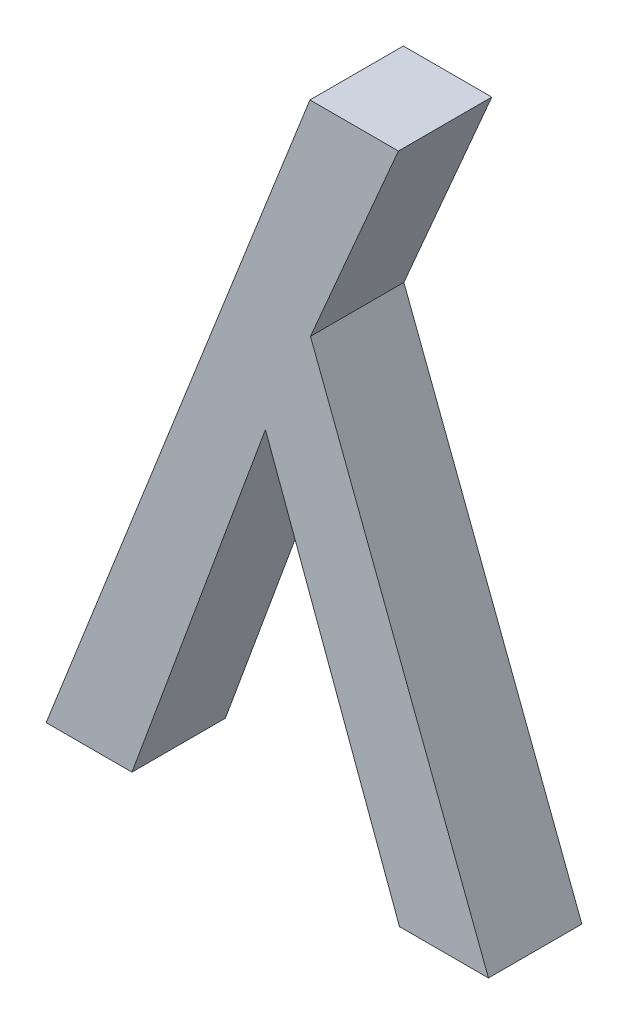
ISO-10303-21;
HEADER;
FILE_DESCRIPTION(('STEP AP214'),'2;1');
FILE_NAME('part.step','',(''),(''),'','','');
FILE_SCHEMA(('AUTOMOTIVE_DESIGN { 1 0 10303 214 1 1 1 1 }'));
ENDSEC;
DATA;
#1=APPLICATION_CONTEXT('core data for automotive mechanical design processes');
#2=APPLICATION_PROTOCOL_DEFINITION('international standard','automotive_design',2000,#1);
#3=PRODUCT_CONTEXT('',#1,'mechanical');
#4=PRODUCT('Part','Part','',(#3));
#5=PRODUCT_RELATED_PRODUCT_CATEGORY('part','',(#4));
#6=PRODUCT_DEFINITION_FORMATION('','',#4);
#7=PRODUCT_DEFINITION_CONTEXT('part definition',#1,'design');
#8=PRODUCT_DEFINITION('design','',#6,#7);
#9=PRODUCT_DEFINITION_SHAPE('','',#8);
#10=(LENGTH_UNIT() NAMED_UNIT(*) SI_UNIT(.MILLI.,.METRE.));
#11=(NAMED_UNIT(*) PLANE_ANGLE_UNIT() SI_UNIT($,.RADIAN.));
#12=(NAMED_UNIT(*) SI_UNIT($,.STERADIAN.) SOLID_ANGLE_UNIT());
#13=UNCERTAINTY_MEASURE_WITH_UNIT(LENGTH_MEASURE(1.E-05),#10,'distance_accuracy_value','');
#14=(GEOMETRIC_REPRESENTATION_CONTEXT(3) GLOBAL_UNCERTAINTY_ASSIGNED_CONTEXT((#13)) GLOBAL_UNIT_ASSIGNED_CONTEXT((#10,
#11,#12)) REPRESENTATION_CONTEXT('',''));
#15=CARTESIAN_POINT('',(0.,0.,0.));
#16=DIRECTION('',(0.,0.,1.));
#17=DIRECTION('',(1.,0.,0.));
#18=AXIS2_PLACEMENT_3D('',#15,#16,#17);
#19=CARTESIAN_POINT('',(-3.502208364019,1.477755909244,0.));
#20=DIRECTION('',(0.,1.,0.));
#21=DIRECTION('',(-1.,0.,0.));
#22=AXIS2_PLACEMENT_3D('',#19,#20,#21);
#23=PLANE('',#22);
#24=DIRECTION('',(1.,0.,0.));
#25=VECTOR('',#24,1.);
#26=CARTESIAN_POINT('',(-3.596919293124,1.477755909244,0.));
#27=LINE('',#26,#25);
#28=CARTESIAN_POINT('',(-3.596919293124,1.477755909244,0.));
#29=VERTEX_POINT('',#28);
#30=CARTESIAN_POINT('',(-3.502208364019,1.477755909244,0.));
#31=VERTEX_POINT('',#30);
#32=EDGE_CURVE('E11',#29,#31,#27,.T.);
#33=ORIENTED_EDGE('',*,*,#32,.F.);
#34=DIRECTION('',(0.,0.,1.));
#35=VECTOR('',#34,1.);
#36=CARTESIAN_POINT('',(-3.596919293124,1.477755909244,0.));
#37=LINE('',#36,#35);
#38=CARTESIAN_POINT('',(-3.596919293124,1.477755909244,0.1));
#39=VERTEX_POINT('',#38);
#40=EDGE_CURVE('E24',#29,#39,#37,.T.);
#41=ORIENTED_EDGE('',*,*,#40,.T.);
#42=DIRECTION('',(-1.,0.,0.));
#43=VECTOR('',#42,1.);
#44=CARTESIAN_POINT('',(-3.596919293124,1.477755909244,0.1));
#45=LINE('',#44,#43);
#46=CARTESIAN_POINT('',(-3.502208364019,1.477755909244,0.1));
#47=VERTEX_POINT('',#46);
#48=EDGE_CURVE('E100',#47,#39,#45,.T.);
#49=ORIENTED_EDGE('',*,*,#48,.F.);
#50=DIRECTION('',(0.,0.,1.));
#51=VECTOR('',#50,1.);
#52=CARTESIAN_POINT('',(-3.502208364019,1.477755909244,0.));
#53=LINE('',#52,#51);
#54=EDGE_CURVE('E141',#31,#47,#53,.T.);
#55=ORIENTED_EDGE('',*,*,#54,.F.);
#56=EDGE_LOOP('',(#33,#41,#49,#55));
#57=FACE_BOUND('',#56,.T.);
#58=ADVANCED_FACE('F17',(#57),#23,.T.);
#59=CARTESIAN_POINT('',(-3.596352161812,1.25884322281,0.));
#60=DIRECTION('',(0.918651913198309,-0.395067921219994,0.));
#61=DIRECTION('',(0.395067921219994,0.918651913198309,0.));
#62=AXIS2_PLACEMENT_3D('',#59,#60,#61);
#63=PLANE('',#62);
#64=DIRECTION('',(-0.395067921219994,-0.918651913198308,0.));
#65=VECTOR('',#64,1.);
#66=CARTESIAN_POINT('',(-3.502208364019,1.477755909244,0.));
#67=LINE('',#66,#65);
#68=CARTESIAN_POINT('',(-3.596352161812,1.25884322281,0.));
#69=VERTEX_POINT('',#68);
#70=EDGE_CURVE('E139',#31,#69,#67,.T.);
#71=ORIENTED_EDGE('',*,*,#70,.F.);
#72=ORIENTED_EDGE('',*,*,#54,.T.);
#73=DIRECTION('',(0.395067921219994,0.918651913198308,0.));
#74=VECTOR('',#73,1.);
#75=CARTESIAN_POINT('',(-3.502208364019,1.477755909244,0.1));
#76=LINE('',#75,#74);
#77=CARTESIAN_POINT('',(-3.596352161812,1.25884322281,0.1));
#78=VERTEX_POINT('',#77);
#79=EDGE_CURVE('E137',#78,#47,#76,.T.);
#80=ORIENTED_EDGE('',*,*,#79,.F.);
#81=DIRECTION('',(0.,0.,1.));
#82=VECTOR('',#81,1.);
#83=CARTESIAN_POINT('',(-3.596352161812,1.25884322281,0.));
#84=LINE('',#83,#82);
#85=EDGE_CURVE('E134',#69,#78,#84,.T.);
#86=ORIENTED_EDGE('',*,*,#85,.F.);
#87=EDGE_LOOP('',(#71,#72,#80,#86));
#88=FACE_BOUND('',#87,.T.);
#89=ADVANCED_FACE('F163',(#88),#63,.T.);
#90=CARTESIAN_POINT('',(-3.405796040979,0.759200536932928,0.));
#91=DIRECTION('',(0.934353260734934,0.356348122141813,0.));
#92=DIRECTION('',(-0.356348122141813,0.934353260734934,0.));
#93=AXIS2_PLACEMENT_3D('',#90,#91,#92);
#94=PLANE('',#93);
#95=DIRECTION('',(0.356348122141813,-0.934353260734934,0.));
#96=VECTOR('',#95,1.);
#97=CARTESIAN_POINT('',(-3.596352161812,1.25884322281,0.));
#98=LINE('',#97,#96);
#99=CARTESIAN_POINT('',(-3.405796040979,0.759200536932928,0.));
#100=VERTEX_POINT('',#99);
#101=EDGE_CURVE('E132',#69,#100,#98,.T.);
#102=ORIENTED_EDGE('',*,*,#101,.F.);
#103=ORIENTED_EDGE('',*,*,#85,.T.);
#104=DIRECTION('',(-0.356348122141813,0.934353260734934,0.));
#105=VECTOR('',#104,1.);
#106=CARTESIAN_POINT('',(-3.596352161812,1.25884322281,0.1));
#107=LINE('',#106,#105);
#108=CARTESIAN_POINT('',(-3.405796040979,0.759200536932928,0.1));
#109=VERTEX_POINT('',#108);
#110=EDGE_CURVE('E129',#109,#78,#107,.T.);
#111=ORIENTED_EDGE('',*,*,#110,.F.);
#112=DIRECTION('',(0.,0.,1.));
#113=VECTOR('',#112,1.);
#114=CARTESIAN_POINT('',(-3.405796040979,0.759200536932928,0.));
#115=LINE('',#114,#113);
#116=EDGE_CURVE('E126',#100,#109,#115,.T.);
#117=ORIENTED_EDGE('',*,*,#116,.F.);
#118=EDGE_LOOP('',(#102,#103,#111,#117));
#119=FACE_BOUND('',#118,.T.);
#120=ADVANCED_FACE('F159',(#119),#94,.T.);
#121=CARTESIAN_POINT('',(-3.501074101395,0.759200536932928,0.));
#122=DIRECTION('',(0.,-1.,0.));
#123=DIRECTION('',(1.,0.,0.));
#124=AXIS2_PLACEMENT_3D('',#121,#122,#123);
#125=PLANE('',#124);
#126=DIRECTION('',(-1.,0.,0.));
#127=VECTOR('',#126,1.);
#128=CARTESIAN_POINT('',(-3.405796040979,0.759200536932928,0.));
#129=LINE('',#128,#127);
#130=CARTESIAN_POINT('',(-3.501074101395,0.759200536932928,0.));
#131=VERTEX_POINT('',#130);
#132=EDGE_CURVE('E124',#100,#131,#129,.T.);
#133=ORIENTED_EDGE('',*,*,#132,.F.);
#134=ORIENTED_EDGE('',*,*,#116,.T.);
#135=DIRECTION('',(1.,0.,0.));
#136=VECTOR('',#135,1.);
#137=CARTESIAN_POINT('',(-3.405796040979,0.759200536932928,0.1));
#138=LINE('',#137,#136);
#139=CARTESIAN_POINT('',(-3.501074101395,0.759200536932928,0.1));
#140=VERTEX_POINT('',#139);
#141=EDGE_CURVE('E121',#140,#109,#138,.T.);
#142=ORIENTED_EDGE('',*,*,#141,.F.);
#143=DIRECTION('',(0.,0.,1.));
#144=VECTOR('',#143,1.);
#145=CARTESIAN_POINT('',(-3.501074101395,0.759200536932928,0.));
#146=LINE('',#145,#144);
#147=EDGE_CURVE('E118',#131,#140,#146,.T.);
#148=ORIENTED_EDGE('',*,*,#147,.F.);
#149=EDGE_LOOP('',(#133,#134,#142,#148));
#150=FACE_BOUND('',#149,.T.);
#151=ADVANCED_FACE('F155',(#150),#125,.T.);
#152=CARTESIAN_POINT('',(-3.644558323333,1.148252616969,0.));
#153=DIRECTION('',(-0.938226310403914,-0.346022239842844,0.));
#154=DIRECTION('',(0.346022239842844,-0.938226310403914,0.));
#155=AXIS2_PLACEMENT_3D('',#152,#153,#154);
#156=PLANE('',#155);
#157=DIRECTION('',(-0.346022239842844,0.938226310403914,0.));
#158=VECTOR('',#157,1.);
#159=CARTESIAN_POINT('',(-3.501074101395,0.759200536932928,0.));
#160=LINE('',#159,#158);
#161=CARTESIAN_POINT('',(-3.644558323333,1.148252616969,0.));
#162=VERTEX_POINT('',#161);
#163=EDGE_CURVE('E116',#131,#162,#160,.T.);
#164=ORIENTED_EDGE('',*,*,#163,.F.);
#165=ORIENTED_EDGE('',*,*,#147,.T.);
#166=DIRECTION('',(0.346022239842844,-0.938226310403914,0.));
#167=VECTOR('',#166,1.);
#168=CARTESIAN_POINT('',(-3.501074101395,0.759200536932928,0.1));
#169=LINE('',#168,#167);
#170=CARTESIAN_POINT('',(-3.644558323333,1.148252616969,0.1));
#171=VERTEX_POINT('',#170);
#172=EDGE_CURVE('E113',#171,#140,#169,.T.);
#173=ORIENTED_EDGE('',*,*,#172,.F.);
#174=DIRECTION('',(0.,0.,1.));
#175=VECTOR('',#174,1.);
#176=CARTESIAN_POINT('',(-3.644558323333,1.148252616969,0.));
#177=LINE('',#176,#175);
#178=EDGE_CURVE('E110',#162,#171,#177,.T.);
#179=ORIENTED_EDGE('',*,*,#178,.F.);
#180=EDGE_LOOP('',(#164,#165,#173,#179));
#181=FACE_BOUND('',#180,.T.);
#182=ADVANCED_FACE('F151',(#181),#156,.T.);
#183=CARTESIAN_POINT('',(-3.787475413958,0.759200536932928,0.));
#184=DIRECTION('',(0.938669759516729,-0.344817462679614,0.));
#185=DIRECTION('',(0.344817462679614,0.938669759516729,0.));
#186=AXIS2_PLACEMENT_3D('',#183,#184,#185);
#187=PLANE('',#186);
#188=DIRECTION('',(-0.344817462679614,-0.938669759516728,0.));
#189=VECTOR('',#188,1.);
#190=CARTESIAN_POINT('',(-3.644558323333,1.148252616969,0.));
#191=LINE('',#190,#189);
#192=CARTESIAN_POINT('',(-3.787475413958,0.759200536932928,0.));
#193=VERTEX_POINT('',#192);
#194=EDGE_CURVE('E108',#162,#193,#191,.T.);
#195=ORIENTED_EDGE('',*,*,#194,.F.);
#196=ORIENTED_EDGE('',*,*,#178,.T.);
#197=DIRECTION('',(0.344817462679614,0.938669759516728,0.));
#198=VECTOR('',#197,1.);
#199=CARTESIAN_POINT('',(-3.644558323333,1.148252616969,0.1));
#200=LINE('',#199,#198);
#201=CARTESIAN_POINT('',(-3.787475413958,0.759200536932928,0.1));
#202=VERTEX_POINT('',#201);
#203=EDGE_CURVE('E106',#202,#171,#200,.T.);
#204=ORIENTED_EDGE('',*,*,#203,.F.);
#205=DIRECTION('',(0.,0.,1.));
#206=VECTOR('',#205,1.);
#207=CARTESIAN_POINT('',(-3.787475413958,0.759200536932928,0.));
#208=LINE('',#207,#206);
#209=EDGE_CURVE('E85',#193,#202,#208,.T.);
#210=ORIENTED_EDGE('',*,*,#209,.F.);
#211=EDGE_LOOP('',(#195,#196,#204,#210));
#212=FACE_BOUND('',#211,.T.);
#213=ADVANCED_FACE('F149',(#212),#187,.T.);
#214=CARTESIAN_POINT('',(-3.879350686503,0.759200536932928,0.));
#215=DIRECTION('',(0.,-1.,0.));
#216=DIRECTION('',(1.,0.,0.));
#217=AXIS2_PLACEMENT_3D('',#214,#215,#216);
#218=PLANE('',#217);
#219=DIRECTION('',(-1.,0.,0.));
#220=VECTOR('',#219,1.);
#221=CARTESIAN_POINT('',(-3.787475413958,0.759200536932928,0.));
#222=LINE('',#221,#220);
#223=CARTESIAN_POINT('',(-3.879350686503,0.759200536932928,0.));
#224=VERTEX_POINT('',#223);
#225=EDGE_CURVE('E89',#193,#224,#222,.T.);
#226=ORIENTED_EDGE('',*,*,#225,.F.);
#227=ORIENTED_EDGE('',*,*,#209,.T.);
#228=DIRECTION('',(1.,0.,0.));
#229=VECTOR('',#228,1.);
#230=CARTESIAN_POINT('',(-3.787475413958,0.759200536932928,0.1));
#231=LINE('',#230,#229);
#232=CARTESIAN_POINT('',(-3.879350686503,0.759200536932928,0.1));
#233=VERTEX_POINT('',#232);
#234=EDGE_CURVE('E78',#233,#202,#231,.T.);
#235=ORIENTED_EDGE('',*,*,#234,.F.);
#236=DIRECTION('',(0.,0.,1.));
#237=VECTOR('',#236,1.);
#238=CARTESIAN_POINT('',(-3.879350686503,0.759200536932928,0.));
#239=LINE('',#238,#237);
#240=EDGE_CURVE('E82',#224,#233,#239,.T.);
#241=ORIENTED_EDGE('',*,*,#240,.F.);
#242=EDGE_LOOP('',(#226,#227,#235,#241));
#243=FACE_BOUND('',#242,.T.);
#244=ADVANCED_FACE('F81',(#243),#218,.T.);
#245=CARTESIAN_POINT('',(-3.596919293124,1.477755909244,0.));
#246=DIRECTION('',(-0.930688981271205,0.365811454359163,0.));
#247=DIRECTION('',(-0.365811454359163,-0.930688981271205,0.));
#248=AXIS2_PLACEMENT_3D('',#245,#246,#247);
#249=PLANE('',#248);
#250=DIRECTION('',(0.365811454359163,0.930688981271205,0.));
#251=VECTOR('',#250,1.);
#252=CARTESIAN_POINT('',(-3.879350686503,0.759200536932928,0.));
#253=LINE('',#252,#251);
#254=EDGE_CURVE('E95',#224,#29,#253,.T.);
#255=ORIENTED_EDGE('',*,*,#254,.F.);
#256=ORIENTED_EDGE('',*,*,#240,.T.);
#257=DIRECTION('',(-0.365811454359163,-0.930688981271205,0.));
#258=VECTOR('',#257,1.);
#259=CARTESIAN_POINT('',(-3.879350686503,0.759200536932928,0.1));
#260=LINE('',#259,#258);
#261=EDGE_CURVE('E94',#39,#233,#260,.T.);
#262=ORIENTED_EDGE('',*,*,#261,.F.);
#263=ORIENTED_EDGE('',*,*,#40,.F.);
#264=EDGE_LOOP('',(#255,#256,#262,#263));
#265=FACE_BOUND('',#264,.T.);
#266=ADVANCED_FACE('F93',(#265),#249,.T.);
#267=CARTESIAN_POINT('',(-3.630563409916,1.054921465346,0.));
#268=DIRECTION('',(0.,0.,1.));
#269=DIRECTION('',(1.,0.,0.));
#270=AXIS2_PLACEMENT_3D('',#267,#268,#269);
#271=PLANE('',#270);
#272=ORIENTED_EDGE('',*,*,#254,.T.);
#273=ORIENTED_EDGE('',*,*,#32,.T.);
#274=ORIENTED_EDGE('',*,*,#70,.T.);
#275=ORIENTED_EDGE('',*,*,#101,.T.);
#276=ORIENTED_EDGE('',*,*,#132,.T.);
#277=ORIENTED_EDGE('',*,*,#163,.T.);
#278=ORIENTED_EDGE('',*,*,#194,.T.);
#279=ORIENTED_EDGE('',*,*,#225,.T.);
#280=EDGE_LOOP('',(#272,#273,#274,#275,#276,#277,#278,#279));
#281=FACE_BOUND('',#280,.T.);
#282=ADVANCED_FACE('F144',(#281),#271,.F.);
#283=CARTESIAN_POINT('',(-3.630563409916,1.054921465346,0.1));
#284=DIRECTION('',(0.,0.,1.));
#285=DIRECTION('',(1.,0.,0.));
#286=AXIS2_PLACEMENT_3D('',#283,#284,#285);
#287=PLANE('',#286);
#288=ORIENTED_EDGE('',*,*,#261,.T.);
#289=ORIENTED_EDGE('',*,*,#234,.T.);
#290=ORIENTED_EDGE('',*,*,#203,.T.);
#291=ORIENTED_EDGE('',*,*,#172,.T.);
#292=ORIENTED_EDGE('',*,*,#141,.T.);
#293=ORIENTED_EDGE('',*,*,#110,.T.);
#294=ORIENTED_EDGE('',*,*,#79,.T.);
#295=ORIENTED_EDGE('',*,*,#48,.T.);
#296=EDGE_LOOP('',(#288,#289,#290,#291,#292,#293,#294,#295));
#297=FACE_BOUND('',#296,.T.);
#298=ADVANCED_FACE('F98',(#297),#287,.T.);
#299=CLOSED_SHELL('',(#58,#89,#120,#151,#182,#213,#244,#266,#282,#298));
#300=MANIFOLD_SOLID_BREP('B1',#299);
#301=ADVANCED_BREP_SHAPE_REPRESENTATION('',(#18,#300),#14);
#302=SHAPE_DEFINITION_REPRESENTATION(#9,#301);
ENDSEC;
END-ISO-10303-21;
